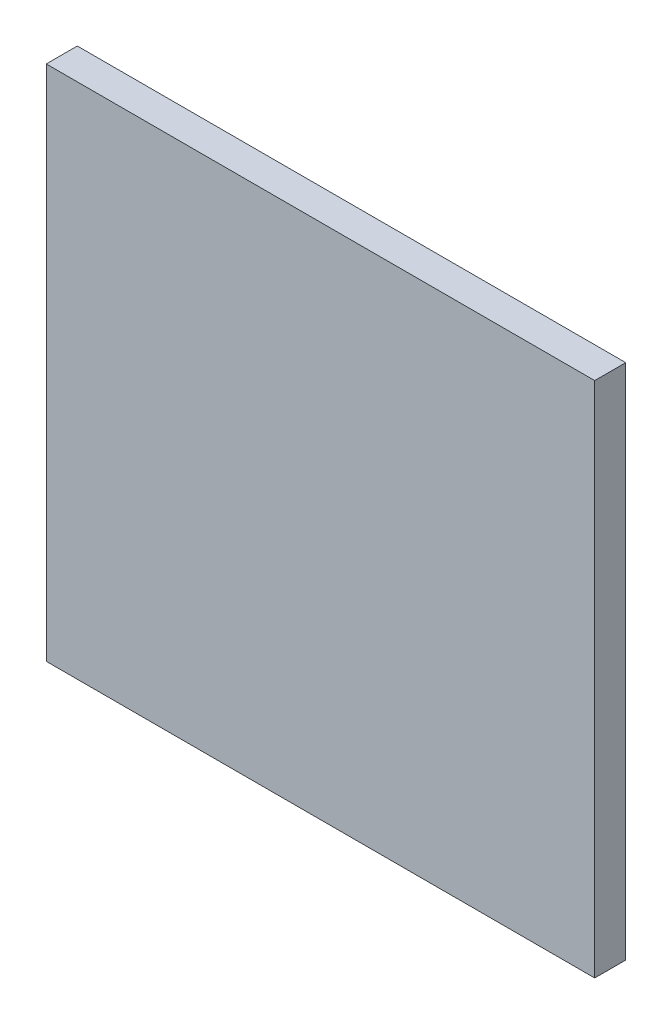
ISO-10303-21;
HEADER;
FILE_DESCRIPTION(('STEP AP214'),'2;1');
FILE_NAME('part.step','',(''),(''),'','','');
FILE_SCHEMA(('AUTOMOTIVE_DESIGN { 1 0 10303 214 1 1 1 1 }'));
ENDSEC;
DATA;
#1=APPLICATION_CONTEXT('core data for automotive mechanical design processes');
#2=APPLICATION_PROTOCOL_DEFINITION('international standard','automotive_design',2000,#1);
#3=PRODUCT_CONTEXT('',#1,'mechanical');
#4=PRODUCT('Part','Part','',(#3));
#5=PRODUCT_RELATED_PRODUCT_CATEGORY('part','',(#4));
#6=PRODUCT_DEFINITION_FORMATION('','',#4);
#7=PRODUCT_DEFINITION_CONTEXT('part definition',#1,'design');
#8=PRODUCT_DEFINITION('design','',#6,#7);
#9=PRODUCT_DEFINITION_SHAPE('','',#8);
#10=(LENGTH_UNIT() NAMED_UNIT(*) SI_UNIT(.MILLI.,.METRE.));
#11=(NAMED_UNIT(*) PLANE_ANGLE_UNIT() SI_UNIT($,.RADIAN.));
#12=(NAMED_UNIT(*) SI_UNIT($,.STERADIAN.) SOLID_ANGLE_UNIT());
#13=UNCERTAINTY_MEASURE_WITH_UNIT(LENGTH_MEASURE(1.E-05),#10,'distance_accuracy_value','');
#14=(GEOMETRIC_REPRESENTATION_CONTEXT(3) GLOBAL_UNCERTAINTY_ASSIGNED_CONTEXT((#13)) GLOBAL_UNIT_ASSIGNED_CONTEXT((#10,
#11,#12)) REPRESENTATION_CONTEXT('',''));
#15=CARTESIAN_POINT('',(0.,0.,0.));
#16=DIRECTION('',(0.,0.,1.));
#17=DIRECTION('',(1.,0.,0.));
#18=AXIS2_PLACEMENT_3D('',#15,#16,#17);
#19=CARTESIAN_POINT('',(-36.0143442622951,24.5901639344262,3.));
#20=DIRECTION('',(1.,0.,0.));
#21=DIRECTION('',(0.,0.,-1.));
#22=AXIS2_PLACEMENT_3D('',#19,#20,#21);
#23=PLANE('',#22);
#24=DIRECTION('',(0.,-1.,0.));
#25=VECTOR('',#24,1.);
#26=CARTESIAN_POINT('',(-36.0143442622951,24.5901639344262,0.));
#27=LINE('',#26,#25);
#28=CARTESIAN_POINT('',(-36.0143442622951,24.5901639344262,0.));
#29=VERTEX_POINT('',#28);
#30=CARTESIAN_POINT('',(-36.0143442622951,-25.4098360655738,0.));
#31=VERTEX_POINT('',#30);
#32=EDGE_CURVE('E96',#29,#31,#27,.T.);
#33=ORIENTED_EDGE('',*,*,#32,.T.);
#34=DIRECTION('',(0.,0.,-1.));
#35=VECTOR('',#34,1.);
#36=CARTESIAN_POINT('',(-36.0143442622951,-25.4098360655738,3.));
#37=LINE('',#36,#35);
#38=CARTESIAN_POINT('',(-36.0143442622951,-25.4098360655738,3.));
#39=VERTEX_POINT('',#38);
#40=EDGE_CURVE('E11',#39,#31,#37,.T.);
#41=ORIENTED_EDGE('',*,*,#40,.F.);
#42=DIRECTION('',(0.,-1.,0.));
#43=VECTOR('',#42,1.);
#44=CARTESIAN_POINT('',(-36.0143442622951,24.5901639344262,3.));
#45=LINE('',#44,#43);
#46=CARTESIAN_POINT('',(-36.0143442622951,24.5901639344262,3.));
#47=VERTEX_POINT('',#46);
#48=EDGE_CURVE('E84',#47,#39,#45,.T.);
#49=ORIENTED_EDGE('',*,*,#48,.F.);
#50=DIRECTION('',(0.,0.,-1.));
#51=VECTOR('',#50,1.);
#52=CARTESIAN_POINT('',(-36.0143442622951,24.5901639344262,3.));
#53=LINE('',#52,#51);
#54=EDGE_CURVE('E92',#47,#29,#53,.T.);
#55=ORIENTED_EDGE('',*,*,#54,.T.);
#56=EDGE_LOOP('',(#33,#41,#49,#55));
#57=FACE_BOUND('',#56,.T.);
#58=ADVANCED_FACE('F33',(#57),#23,.F.);
#59=CARTESIAN_POINT('',(-36.0143442622951,-25.4098360655738,3.));
#60=DIRECTION('',(0.,1.,0.));
#61=DIRECTION('',(-1.,0.,0.));
#62=AXIS2_PLACEMENT_3D('',#59,#60,#61);
#63=PLANE('',#62);
#64=DIRECTION('',(1.,0.,0.));
#65=VECTOR('',#64,1.);
#66=CARTESIAN_POINT('',(-36.0143442622951,-25.4098360655738,0.));
#67=LINE('',#66,#65);
#68=CARTESIAN_POINT('',(16.9856557377049,-25.4098360655738,0.));
#69=VERTEX_POINT('',#68);
#70=EDGE_CURVE('E88',#31,#69,#67,.T.);
#71=ORIENTED_EDGE('',*,*,#70,.T.);
#72=DIRECTION('',(0.,0.,-1.));
#73=VECTOR('',#72,1.);
#74=CARTESIAN_POINT('',(16.9856557377049,-25.4098360655738,3.));
#75=LINE('',#74,#73);
#76=CARTESIAN_POINT('',(16.9856557377049,-25.4098360655738,3.));
#77=VERTEX_POINT('',#76);
#78=EDGE_CURVE('E41',#77,#69,#75,.T.);
#79=ORIENTED_EDGE('',*,*,#78,.F.);
#80=DIRECTION('',(1.,0.,0.));
#81=VECTOR('',#80,1.);
#82=CARTESIAN_POINT('',(-36.0143442622951,-25.4098360655738,3.));
#83=LINE('',#82,#81);
#84=EDGE_CURVE('E79',#39,#77,#83,.T.);
#85=ORIENTED_EDGE('',*,*,#84,.F.);
#86=ORIENTED_EDGE('',*,*,#40,.T.);
#87=EDGE_LOOP('',(#71,#79,#85,#86));
#88=FACE_BOUND('',#87,.T.);
#89=ADVANCED_FACE('F87',(#88),#63,.F.);
#90=CARTESIAN_POINT('',(16.9856557377049,24.5901639344262,3.));
#91=DIRECTION('',(-1.,0.,0.));
#92=DIRECTION('',(0.,-1.,0.));
#93=AXIS2_PLACEMENT_3D('',#90,#91,#92);
#94=PLANE('',#93);
#95=DIRECTION('',(0.,1.,0.));
#96=VECTOR('',#95,1.);
#97=CARTESIAN_POINT('',(16.9856557377049,24.5901639344262,0.));
#98=LINE('',#97,#96);
#99=CARTESIAN_POINT('',(16.9856557377049,24.5901639344262,0.));
#100=VERTEX_POINT('',#99);
#101=EDGE_CURVE('E66',#69,#100,#98,.T.);
#102=ORIENTED_EDGE('',*,*,#101,.T.);
#103=DIRECTION('',(0.,0.,-1.));
#104=VECTOR('',#103,1.);
#105=CARTESIAN_POINT('',(16.9856557377049,24.5901639344262,3.));
#106=LINE('',#105,#104);
#107=CARTESIAN_POINT('',(16.9856557377049,24.5901639344262,3.));
#108=VERTEX_POINT('',#107);
#109=EDGE_CURVE('E89',#108,#100,#106,.T.);
#110=ORIENTED_EDGE('',*,*,#109,.F.);
#111=DIRECTION('',(0.,1.,0.));
#112=VECTOR('',#111,1.);
#113=CARTESIAN_POINT('',(16.9856557377049,24.5901639344262,3.));
#114=LINE('',#113,#112);
#115=EDGE_CURVE('E82',#77,#108,#114,.T.);
#116=ORIENTED_EDGE('',*,*,#115,.F.);
#117=ORIENTED_EDGE('',*,*,#78,.T.);
#118=EDGE_LOOP('',(#102,#110,#116,#117));
#119=FACE_BOUND('',#118,.T.);
#120=ADVANCED_FACE('F90',(#119),#94,.F.);
#121=CARTESIAN_POINT('',(-36.0143442622951,24.5901639344262,3.));
#122=DIRECTION('',(0.,-1.,0.));
#123=DIRECTION('',(0.,0.,-1.));
#124=AXIS2_PLACEMENT_3D('',#121,#122,#123);
#125=PLANE('',#124);
#126=DIRECTION('',(-1.,0.,0.));
#127=VECTOR('',#126,1.);
#128=CARTESIAN_POINT('',(-36.0143442622951,24.5901639344262,0.));
#129=LINE('',#128,#127);
#130=EDGE_CURVE('E72',#100,#29,#129,.T.);
#131=ORIENTED_EDGE('',*,*,#130,.T.);
#132=ORIENTED_EDGE('',*,*,#54,.F.);
#133=DIRECTION('',(-1.,0.,0.));
#134=VECTOR('',#133,1.);
#135=CARTESIAN_POINT('',(-36.0143442622951,24.5901639344262,3.));
#136=LINE('',#135,#134);
#137=EDGE_CURVE('E49',#108,#47,#136,.T.);
#138=ORIENTED_EDGE('',*,*,#137,.F.);
#139=ORIENTED_EDGE('',*,*,#109,.T.);
#140=EDGE_LOOP('',(#131,#132,#138,#139));
#141=FACE_BOUND('',#140,.T.);
#142=ADVANCED_FACE('F103',(#141),#125,.F.);
#143=CARTESIAN_POINT('',(0.,0.,3.));
#144=DIRECTION('',(0.,0.,1.));
#145=DIRECTION('',(1.,0.,0.));
#146=AXIS2_PLACEMENT_3D('',#143,#144,#145);
#147=PLANE('',#146);
#148=ORIENTED_EDGE('',*,*,#48,.T.);
#149=ORIENTED_EDGE('',*,*,#84,.T.);
#150=ORIENTED_EDGE('',*,*,#115,.T.);
#151=ORIENTED_EDGE('',*,*,#137,.T.);
#152=EDGE_LOOP('',(#148,#149,#150,#151));
#153=FACE_BOUND('',#152,.T.);
#154=ADVANCED_FACE('F80',(#153),#147,.T.);
#155=CARTESIAN_POINT('',(0.,0.,0.));
#156=DIRECTION('',(0.,0.,1.));
#157=DIRECTION('',(1.,0.,0.));
#158=AXIS2_PLACEMENT_3D('',#155,#156,#157);
#159=PLANE('',#158);
#160=ORIENTED_EDGE('',*,*,#32,.F.);
#161=ORIENTED_EDGE('',*,*,#130,.F.);
#162=ORIENTED_EDGE('',*,*,#101,.F.);
#163=ORIENTED_EDGE('',*,*,#70,.F.);
#164=EDGE_LOOP('',(#160,#161,#162,#163));
#165=FACE_BOUND('',#164,.T.);
#166=ADVANCED_FACE('F106',(#165),#159,.F.);
#167=CLOSED_SHELL('',(#58,#89,#120,#142,#154,#166));
#168=MANIFOLD_SOLID_BREP('B2',#167);
#169=ADVANCED_BREP_SHAPE_REPRESENTATION('',(#18,#168),#14);
#170=SHAPE_DEFINITION_REPRESENTATION(#9,#169);
ENDSEC;
END-ISO-10303-21;
